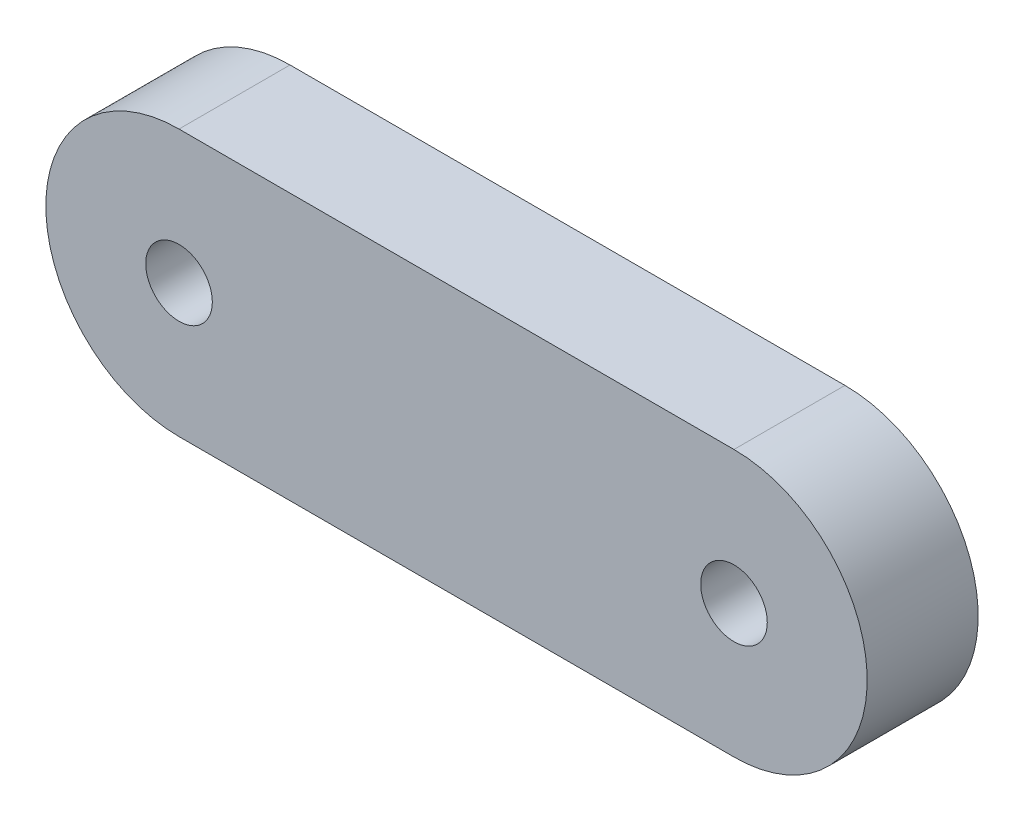
ISO-10303-21;
HEADER;
FILE_DESCRIPTION(('STEP AP214'),'2;1');
FILE_NAME('part.step','',(''),(''),'','','');
FILE_SCHEMA(('AUTOMOTIVE_DESIGN { 1 0 10303 214 1 1 1 1 }'));
ENDSEC;
DATA;
#1=APPLICATION_CONTEXT('core data for automotive mechanical design processes');
#2=APPLICATION_PROTOCOL_DEFINITION('international standard','automotive_design',2000,#1);
#3=PRODUCT_CONTEXT('',#1,'mechanical');
#4=PRODUCT('Part','Part','',(#3));
#5=PRODUCT_RELATED_PRODUCT_CATEGORY('part','',(#4));
#6=PRODUCT_DEFINITION_FORMATION('','',#4);
#7=PRODUCT_DEFINITION_CONTEXT('part definition',#1,'design');
#8=PRODUCT_DEFINITION('design','',#6,#7);
#9=PRODUCT_DEFINITION_SHAPE('','',#8);
#10=(LENGTH_UNIT() NAMED_UNIT(*) SI_UNIT(.MILLI.,.METRE.));
#11=(NAMED_UNIT(*) PLANE_ANGLE_UNIT() SI_UNIT($,.RADIAN.));
#12=(NAMED_UNIT(*) SI_UNIT($,.STERADIAN.) SOLID_ANGLE_UNIT());
#13=UNCERTAINTY_MEASURE_WITH_UNIT(LENGTH_MEASURE(1.E-05),#10,'distance_accuracy_value','');
#14=(GEOMETRIC_REPRESENTATION_CONTEXT(3) GLOBAL_UNCERTAINTY_ASSIGNED_CONTEXT((#13)) GLOBAL_UNIT_ASSIGNED_CONTEXT((#10,
#11,#12)) REPRESENTATION_CONTEXT('',''));
#15=CARTESIAN_POINT('',(0.,0.,0.));
#16=DIRECTION('',(0.,0.,1.));
#17=DIRECTION('',(1.,0.,0.));
#18=AXIS2_PLACEMENT_3D('',#15,#16,#17);
#19=CARTESIAN_POINT('',(0.,0.,5.));
#20=DIRECTION('',(0.,0.,1.));
#21=DIRECTION('',(1.,0.,0.));
#22=AXIS2_PLACEMENT_3D('',#19,#20,#21);
#23=PLANE('',#22);
#24=CARTESIAN_POINT('',(25.,0.,5.));
#25=DIRECTION('',(0.,0.,1.));
#26=DIRECTION('',(1.,0.,0.));
#27=AXIS2_PLACEMENT_3D('',#24,#25,#26);
#28=CIRCLE('',#27,1.5);
#29=CARTESIAN_POINT('',(26.5,0.,5.));
#30=VERTEX_POINT('',#29);
#31=EDGE_CURVE('E100',#30,#30,#28,.T.);
#32=ORIENTED_EDGE('',*,*,#31,.F.);
#33=EDGE_LOOP('',(#32));
#34=FACE_BOUND('',#33,.T.);
#35=CARTESIAN_POINT('',(0.,0.,5.));
#36=DIRECTION('',(0.,0.,1.));
#37=DIRECTION('',(1.,0.,0.));
#38=AXIS2_PLACEMENT_3D('',#35,#36,#37);
#39=CIRCLE('',#38,6.);
#40=CARTESIAN_POINT('',(0.,6.,5.));
#41=VERTEX_POINT('',#40);
#42=CARTESIAN_POINT('',(0.,-6.,5.));
#43=VERTEX_POINT('',#42);
#44=EDGE_CURVE('E85',#41,#43,#39,.T.);
#45=ORIENTED_EDGE('',*,*,#44,.T.);
#46=DIRECTION('',(1.,0.,0.));
#47=VECTOR('',#46,1.);
#48=CARTESIAN_POINT('',(0.,-6.,5.));
#49=LINE('',#48,#47);
#50=CARTESIAN_POINT('',(25.,-6.,5.));
#51=VERTEX_POINT('',#50);
#52=EDGE_CURVE('E80',#43,#51,#49,.T.);
#53=ORIENTED_EDGE('',*,*,#52,.T.);
#54=CARTESIAN_POINT('',(25.,0.,5.));
#55=DIRECTION('',(0.,0.,1.));
#56=DIRECTION('',(1.,0.,0.));
#57=AXIS2_PLACEMENT_3D('',#54,#55,#56);
#58=CIRCLE('',#57,6.);
#59=CARTESIAN_POINT('',(25.,6.,5.));
#60=VERTEX_POINT('',#59);
#61=EDGE_CURVE('E83',#51,#60,#58,.T.);
#62=ORIENTED_EDGE('',*,*,#61,.T.);
#63=DIRECTION('',(-1.,0.,0.));
#64=VECTOR('',#63,1.);
#65=CARTESIAN_POINT('',(0.,6.,5.));
#66=LINE('',#65,#64);
#67=EDGE_CURVE('E50',#60,#41,#66,.T.);
#68=ORIENTED_EDGE('',*,*,#67,.T.);
#69=EDGE_LOOP('',(#45,#53,#62,#68));
#70=FACE_BOUND('',#69,.T.);
#71=CARTESIAN_POINT('',(0.,0.,5.));
#72=DIRECTION('',(0.,0.,1.));
#73=DIRECTION('',(1.,0.,0.));
#74=AXIS2_PLACEMENT_3D('',#71,#72,#73);
#75=CIRCLE('',#74,1.5);
#76=CARTESIAN_POINT('',(1.5,0.,5.));
#77=VERTEX_POINT('',#76);
#78=EDGE_CURVE('E115',#77,#77,#75,.T.);
#79=ORIENTED_EDGE('',*,*,#78,.F.);
#80=EDGE_LOOP('',(#79));
#81=FACE_BOUND('',#80,.T.);
#82=ADVANCED_FACE('F33',(#34,#70,#81),#23,.T.);
#83=CARTESIAN_POINT('',(0.,0.,0.));
#84=DIRECTION('',(0.,0.,1.));
#85=DIRECTION('',(1.,0.,0.));
#86=AXIS2_PLACEMENT_3D('',#83,#84,#85);
#87=PLANE('',#86);
#88=CARTESIAN_POINT('',(25.,0.,0.));
#89=DIRECTION('',(0.,0.,1.));
#90=DIRECTION('',(1.,0.,0.));
#91=AXIS2_PLACEMENT_3D('',#88,#89,#90);
#92=CIRCLE('',#91,1.5);
#93=CARTESIAN_POINT('',(26.5,0.,0.));
#94=VERTEX_POINT('',#93);
#95=EDGE_CURVE('E112',#94,#94,#92,.T.);
#96=ORIENTED_EDGE('',*,*,#95,.T.);
#97=EDGE_LOOP('',(#96));
#98=FACE_BOUND('',#97,.T.);
#99=CARTESIAN_POINT('',(0.,0.,0.));
#100=DIRECTION('',(0.,0.,1.));
#101=DIRECTION('',(1.,0.,0.));
#102=AXIS2_PLACEMENT_3D('',#99,#100,#101);
#103=CIRCLE('',#102,6.);
#104=CARTESIAN_POINT('',(0.,6.,0.));
#105=VERTEX_POINT('',#104);
#106=CARTESIAN_POINT('',(0.,-6.,0.));
#107=VERTEX_POINT('',#106);
#108=EDGE_CURVE('E97',#105,#107,#103,.T.);
#109=ORIENTED_EDGE('',*,*,#108,.F.);
#110=DIRECTION('',(-1.,0.,0.));
#111=VECTOR('',#110,1.);
#112=CARTESIAN_POINT('',(0.,6.,0.));
#113=LINE('',#112,#111);
#114=CARTESIAN_POINT('',(25.,6.,0.));
#115=VERTEX_POINT('',#114);
#116=EDGE_CURVE('E73',#115,#105,#113,.T.);
#117=ORIENTED_EDGE('',*,*,#116,.F.);
#118=CARTESIAN_POINT('',(25.,0.,0.));
#119=DIRECTION('',(0.,0.,1.));
#120=DIRECTION('',(1.,0.,0.));
#121=AXIS2_PLACEMENT_3D('',#118,#119,#120);
#122=CIRCLE('',#121,6.);
#123=CARTESIAN_POINT('',(25.,-6.,0.));
#124=VERTEX_POINT('',#123);
#125=EDGE_CURVE('E67',#124,#115,#122,.T.);
#126=ORIENTED_EDGE('',*,*,#125,.F.);
#127=DIRECTION('',(1.,0.,0.));
#128=VECTOR('',#127,1.);
#129=CARTESIAN_POINT('',(0.,-6.,0.));
#130=LINE('',#129,#128);
#131=EDGE_CURVE('E89',#107,#124,#130,.T.);
#132=ORIENTED_EDGE('',*,*,#131,.F.);
#133=EDGE_LOOP('',(#109,#117,#126,#132));
#134=FACE_BOUND('',#133,.T.);
#135=CARTESIAN_POINT('',(0.,0.,0.));
#136=DIRECTION('',(0.,0.,1.));
#137=DIRECTION('',(1.,0.,0.));
#138=AXIS2_PLACEMENT_3D('',#135,#136,#137);
#139=CIRCLE('',#138,1.5);
#140=CARTESIAN_POINT('',(1.5,0.,0.));
#141=VERTEX_POINT('',#140);
#142=EDGE_CURVE('E118',#141,#141,#139,.T.);
#143=ORIENTED_EDGE('',*,*,#142,.T.);
#144=EDGE_LOOP('',(#143));
#145=FACE_BOUND('',#144,.T.);
#146=ADVANCED_FACE('F108',(#98,#134,#145),#87,.F.);
#147=CARTESIAN_POINT('',(0.,0.,5.));
#148=DIRECTION('',(0.,0.,-1.));
#149=DIRECTION('',(-1.,0.,0.));
#150=AXIS2_PLACEMENT_3D('',#147,#148,#149);
#151=CYLINDRICAL_SURFACE('',#150,6.);
#152=ORIENTED_EDGE('',*,*,#108,.T.);
#153=DIRECTION('',(0.,0.,-1.));
#154=VECTOR('',#153,1.);
#155=CARTESIAN_POINT('',(0.,-6.,5.));
#156=LINE('',#155,#154);
#157=EDGE_CURVE('E11',#43,#107,#156,.T.);
#158=ORIENTED_EDGE('',*,*,#157,.F.);
#159=ORIENTED_EDGE('',*,*,#44,.F.);
#160=DIRECTION('',(0.,0.,-1.));
#161=VECTOR('',#160,1.);
#162=CARTESIAN_POINT('',(0.,6.,5.));
#163=LINE('',#162,#161);
#164=EDGE_CURVE('E93',#41,#105,#163,.T.);
#165=ORIENTED_EDGE('',*,*,#164,.T.);
#166=EDGE_LOOP('',(#152,#158,#159,#165));
#167=FACE_BOUND('',#166,.T.);
#168=ADVANCED_FACE('F35',(#167),#151,.T.);
#169=CARTESIAN_POINT('',(0.,-6.,5.));
#170=DIRECTION('',(0.,1.,0.));
#171=DIRECTION('',(-1.,0.,0.));
#172=AXIS2_PLACEMENT_3D('',#169,#170,#171);
#173=PLANE('',#172);
#174=ORIENTED_EDGE('',*,*,#131,.T.);
#175=DIRECTION('',(0.,0.,-1.));
#176=VECTOR('',#175,1.);
#177=CARTESIAN_POINT('',(25.,-6.,5.));
#178=LINE('',#177,#176);
#179=EDGE_CURVE('E42',#51,#124,#178,.T.);
#180=ORIENTED_EDGE('',*,*,#179,.F.);
#181=ORIENTED_EDGE('',*,*,#52,.F.);
#182=ORIENTED_EDGE('',*,*,#157,.T.);
#183=EDGE_LOOP('',(#174,#180,#181,#182));
#184=FACE_BOUND('',#183,.T.);
#185=ADVANCED_FACE('F88',(#184),#173,.F.);
#186=CARTESIAN_POINT('',(25.,0.,5.));
#187=DIRECTION('',(0.,0.,-1.));
#188=DIRECTION('',(-1.,0.,0.));
#189=AXIS2_PLACEMENT_3D('',#186,#187,#188);
#190=CYLINDRICAL_SURFACE('',#189,6.);
#191=ORIENTED_EDGE('',*,*,#125,.T.);
#192=DIRECTION('',(0.,0.,-1.));
#193=VECTOR('',#192,1.);
#194=CARTESIAN_POINT('',(25.,6.,5.));
#195=LINE('',#194,#193);
#196=EDGE_CURVE('E90',#60,#115,#195,.T.);
#197=ORIENTED_EDGE('',*,*,#196,.F.);
#198=ORIENTED_EDGE('',*,*,#61,.F.);
#199=ORIENTED_EDGE('',*,*,#179,.T.);
#200=EDGE_LOOP('',(#191,#197,#198,#199));
#201=FACE_BOUND('',#200,.T.);
#202=ADVANCED_FACE('F91',(#201),#190,.T.);
#203=CARTESIAN_POINT('',(0.,6.,5.));
#204=DIRECTION('',(0.,-1.,0.));
#205=DIRECTION('',(1.,0.,0.));
#206=AXIS2_PLACEMENT_3D('',#203,#204,#205);
#207=PLANE('',#206);
#208=ORIENTED_EDGE('',*,*,#116,.T.);
#209=ORIENTED_EDGE('',*,*,#164,.F.);
#210=ORIENTED_EDGE('',*,*,#67,.F.);
#211=ORIENTED_EDGE('',*,*,#196,.T.);
#212=EDGE_LOOP('',(#208,#209,#210,#211));
#213=FACE_BOUND('',#212,.T.);
#214=ADVANCED_FACE('F105',(#213),#207,.F.);
#215=CARTESIAN_POINT('',(25.,0.,5.));
#216=DIRECTION('',(0.,0.,-1.));
#217=DIRECTION('',(-1.,0.,0.));
#218=AXIS2_PLACEMENT_3D('',#215,#216,#217);
#219=CYLINDRICAL_SURFACE('',#218,1.5);
#220=ORIENTED_EDGE('',*,*,#31,.T.);
#221=EDGE_LOOP('',(#220));
#222=FACE_BOUND('',#221,.T.);
#223=ORIENTED_EDGE('',*,*,#95,.F.);
#224=EDGE_LOOP('',(#223));
#225=FACE_BOUND('',#224,.T.);
#226=ADVANCED_FACE('F136',(#222,#225),#219,.F.);
#227=CARTESIAN_POINT('',(0.,0.,5.));
#228=DIRECTION('',(0.,0.,-1.));
#229=DIRECTION('',(-1.,0.,0.));
#230=AXIS2_PLACEMENT_3D('',#227,#228,#229);
#231=CYLINDRICAL_SURFACE('',#230,1.5);
#232=ORIENTED_EDGE('',*,*,#78,.T.);
#233=EDGE_LOOP('',(#232));
#234=FACE_BOUND('',#233,.T.);
#235=ORIENTED_EDGE('',*,*,#142,.F.);
#236=EDGE_LOOP('',(#235));
#237=FACE_BOUND('',#236,.T.);
#238=ADVANCED_FACE('F124',(#234,#237),#231,.F.);
#239=CLOSED_SHELL('',(#82,#146,#168,#185,#202,#214,#226,#238));
#240=MANIFOLD_SOLID_BREP('B2',#239);
#241=ADVANCED_BREP_SHAPE_REPRESENTATION('',(#18,#240),#14);
#242=SHAPE_DEFINITION_REPRESENTATION(#9,#241);
ENDSEC;
END-ISO-10303-21;
